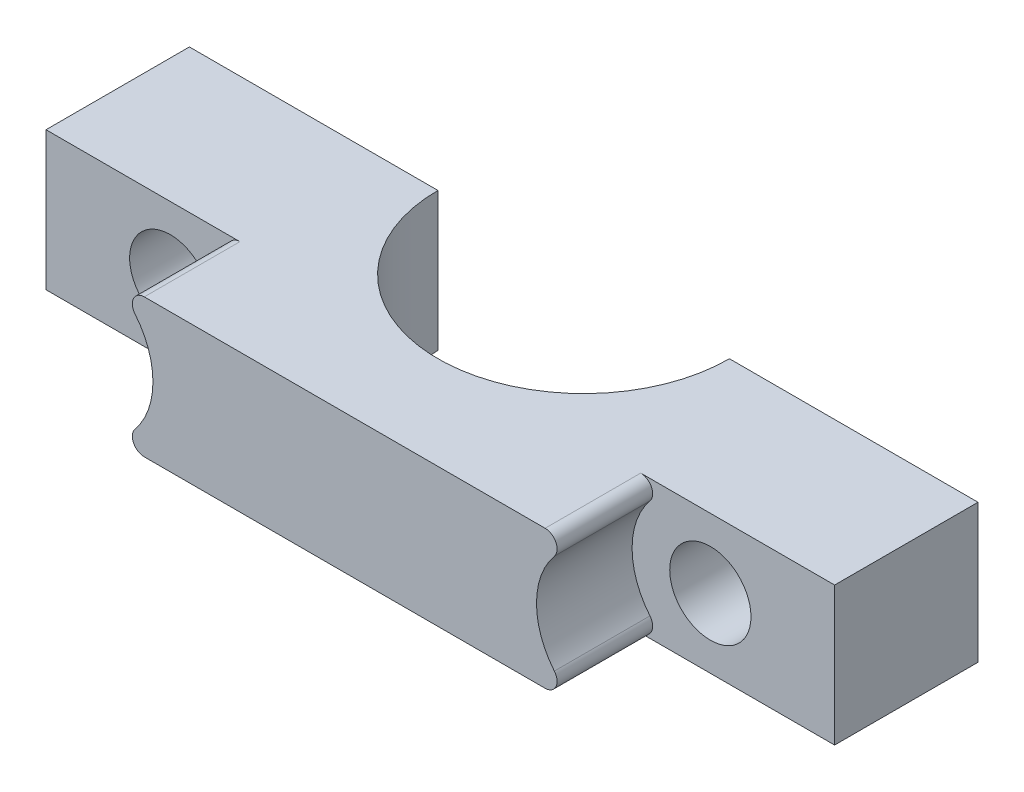
ISO-10303-21;
HEADER;
FILE_DESCRIPTION(('STEP AP214'),'2;1');
FILE_NAME('part.step','',(''),(''),'','','');
FILE_SCHEMA(('AUTOMOTIVE_DESIGN { 1 0 10303 214 1 1 1 1 }'));
ENDSEC;
DATA;
#1=APPLICATION_CONTEXT('core data for automotive mechanical design processes');
#2=APPLICATION_PROTOCOL_DEFINITION('international standard','automotive_design',2000,#1);
#3=PRODUCT_CONTEXT('',#1,'mechanical');
#4=PRODUCT('Part','Part','',(#3));
#5=PRODUCT_RELATED_PRODUCT_CATEGORY('part','',(#4));
#6=PRODUCT_DEFINITION_FORMATION('','',#4);
#7=PRODUCT_DEFINITION_CONTEXT('part definition',#1,'design');
#8=PRODUCT_DEFINITION('design','',#6,#7);
#9=PRODUCT_DEFINITION_SHAPE('','',#8);
#10=(LENGTH_UNIT() NAMED_UNIT(*) SI_UNIT(.MILLI.,.METRE.));
#11=(NAMED_UNIT(*) PLANE_ANGLE_UNIT() SI_UNIT($,.RADIAN.));
#12=(NAMED_UNIT(*) SI_UNIT($,.STERADIAN.) SOLID_ANGLE_UNIT());
#13=UNCERTAINTY_MEASURE_WITH_UNIT(LENGTH_MEASURE(1.E-05),#10,'distance_accuracy_value','');
#14=(GEOMETRIC_REPRESENTATION_CONTEXT(3) GLOBAL_UNCERTAINTY_ASSIGNED_CONTEXT((#13)) GLOBAL_UNIT_ASSIGNED_CONTEXT((#10,
#11,#12)) REPRESENTATION_CONTEXT('',''));
#15=CARTESIAN_POINT('',(0.,0.,0.));
#16=DIRECTION('',(0.,0.,1.));
#17=DIRECTION('',(1.,0.,0.));
#18=AXIS2_PLACEMENT_3D('',#15,#16,#17);
#19=CARTESIAN_POINT('',(-16.5,5.8,-10.));
#20=DIRECTION('',(1.,0.,0.));
#21=DIRECTION('',(0.,0.,-1.));
#22=AXIS2_PLACEMENT_3D('',#19,#20,#21);
#23=PLANE('',#22);
#24=DIRECTION('',(0.,-1.,0.));
#25=VECTOR('',#24,1.);
#26=CARTESIAN_POINT('',(-16.5,5.8,-4.));
#27=LINE('',#26,#25);
#28=CARTESIAN_POINT('',(-16.5,5.8,-4.));
#29=VERTEX_POINT('',#28);
#30=CARTESIAN_POINT('',(-16.5,0.,-4.));
#31=VERTEX_POINT('',#30);
#32=EDGE_CURVE('E272',#29,#31,#27,.T.);
#33=ORIENTED_EDGE('',*,*,#32,.F.);
#34=DIRECTION('',(0.,0.,1.));
#35=VECTOR('',#34,1.);
#36=CARTESIAN_POINT('',(-16.5,5.8,-10.));
#37=LINE('',#36,#35);
#38=CARTESIAN_POINT('',(-16.5,5.8,-10.));
#39=VERTEX_POINT('',#38);
#40=EDGE_CURVE('E175',#39,#29,#37,.T.);
#41=ORIENTED_EDGE('',*,*,#40,.F.);
#42=DIRECTION('',(0.,-1.,0.));
#43=VECTOR('',#42,1.);
#44=CARTESIAN_POINT('',(-16.5,5.8,-10.));
#45=LINE('',#44,#43);
#46=CARTESIAN_POINT('',(-16.5,0.,-10.));
#47=VERTEX_POINT('',#46);
#48=EDGE_CURVE('E176',#39,#47,#45,.T.);
#49=ORIENTED_EDGE('',*,*,#48,.T.);
#50=DIRECTION('',(0.,0.,1.));
#51=VECTOR('',#50,1.);
#52=CARTESIAN_POINT('',(-16.5,0.,-10.));
#53=LINE('',#52,#51);
#54=EDGE_CURVE('E168',#47,#31,#53,.T.);
#55=ORIENTED_EDGE('',*,*,#54,.T.);
#56=EDGE_LOOP('',(#33,#41,#49,#55));
#57=FACE_BOUND('',#56,.T.);
#58=ADVANCED_FACE('F35',(#57),#23,.F.);
#59=CARTESIAN_POINT('',(-11.3,2.9,0.));
#60=DIRECTION('',(0.,0.,1.));
#61=DIRECTION('',(1.,0.,0.));
#62=AXIS2_PLACEMENT_3D('',#59,#60,#61);
#63=CYLINDRICAL_SURFACE('',#62,1.69999999999999);
#64=CARTESIAN_POINT('',(-11.3,2.9,-10.));
#65=DIRECTION('',(0.,0.,1.));
#66=DIRECTION('',(1.,0.,0.));
#67=AXIS2_PLACEMENT_3D('',#64,#65,#66);
#68=CIRCLE('',#67,1.7);
#69=CARTESIAN_POINT('',(-9.6,2.9,-10.));
#70=VERTEX_POINT('',#69);
#71=EDGE_CURVE('E192',#70,#70,#68,.T.);
#72=ORIENTED_EDGE('',*,*,#71,.F.);
#73=EDGE_LOOP('',(#72));
#74=FACE_BOUND('',#73,.T.);
#75=CARTESIAN_POINT('',(-11.3,2.9,-4.));
#76=DIRECTION('',(0.,0.,1.));
#77=DIRECTION('',(1.,0.,0.));
#78=AXIS2_PLACEMENT_3D('',#75,#76,#77);
#79=CIRCLE('',#78,1.69999999999999);
#80=CARTESIAN_POINT('',(-9.6,2.9,-4.));
#81=VERTEX_POINT('',#80);
#82=EDGE_CURVE('E189',#81,#81,#79,.F.);
#83=ORIENTED_EDGE('',*,*,#82,.F.);
#84=EDGE_LOOP('',(#83));
#85=FACE_BOUND('',#84,.T.);
#86=ADVANCED_FACE('F296',(#74,#85),#63,.F.);
#87=CARTESIAN_POINT('',(-16.5,5.8,0.));
#88=DIRECTION('',(0.,0.,-1.));
#89=DIRECTION('',(-1.,0.,0.));
#90=AXIS2_PLACEMENT_3D('',#87,#88,#89);
#91=PLANE('',#90);
#92=DIRECTION('',(1.,0.,0.));
#93=VECTOR('',#92,1.);
#94=CARTESIAN_POINT('',(-16.5,0.,0.));
#95=LINE('',#94,#93);
#96=CARTESIAN_POINT('',(-8.3861322953847,0.,0.));
#97=VERTEX_POINT('',#96);
#98=CARTESIAN_POINT('',(8.3861322953847,0.,0.));
#99=VERTEX_POINT('',#98);
#100=EDGE_CURVE('E163',#97,#99,#95,.T.);
#101=ORIENTED_EDGE('',*,*,#100,.T.);
#102=CARTESIAN_POINT('',(8.3861322953847,0.5,0.));
#103=DIRECTION('',(0.,0.,-1.));
#104=DIRECTION('',(-1.,0.,0.));
#105=AXIS2_PLACEMENT_3D('',#102,#103,#104);
#106=CIRCLE('',#105,0.5);
#107=CARTESIAN_POINT('',(8.77207503771785,0.817880794701987,0.));
#108=VERTEX_POINT('',#107);
#109=EDGE_CURVE('E208',#99,#108,#106,.F.);
#110=ORIENTED_EDGE('',*,*,#109,.T.);
#111=CARTESIAN_POINT('',(11.3,2.9,0.));
#112=DIRECTION('',(0.,0.,1.));
#113=DIRECTION('',(-1.,0.,0.));
#114=AXIS2_PLACEMENT_3D('',#111,#112,#113);
#115=CIRCLE('',#114,3.275);
#116=CARTESIAN_POINT('',(8.77207503771785,4.98211920529801,0.));
#117=VERTEX_POINT('',#116);
#118=EDGE_CURVE('E237',#117,#108,#115,.T.);
#119=ORIENTED_EDGE('',*,*,#118,.F.);
#120=CARTESIAN_POINT('',(8.3861322953847,5.3,0.));
#121=DIRECTION('',(0.,0.,-1.));
#122=DIRECTION('',(-1.,0.,0.));
#123=AXIS2_PLACEMENT_3D('',#120,#121,#122);
#124=CIRCLE('',#123,0.5);
#125=CARTESIAN_POINT('',(8.3861322953847,5.8,0.));
#126=VERTEX_POINT('',#125);
#127=EDGE_CURVE('E206',#117,#126,#124,.F.);
#128=ORIENTED_EDGE('',*,*,#127,.T.);
#129=DIRECTION('',(1.,0.,0.));
#130=VECTOR('',#129,1.);
#131=CARTESIAN_POINT('',(-16.5,5.8,0.));
#132=LINE('',#131,#130);
#133=CARTESIAN_POINT('',(-8.3861322953847,5.8,0.));
#134=VERTEX_POINT('',#133);
#135=EDGE_CURVE('E244',#134,#126,#132,.T.);
#136=ORIENTED_EDGE('',*,*,#135,.F.);
#137=CARTESIAN_POINT('',(-8.3861322953847,5.3,0.));
#138=DIRECTION('',(0.,0.,-1.));
#139=DIRECTION('',(-1.,0.,0.));
#140=AXIS2_PLACEMENT_3D('',#137,#138,#139);
#141=CIRCLE('',#140,0.5);
#142=CARTESIAN_POINT('',(-8.77207503771785,4.98211920529801,0.));
#143=VERTEX_POINT('',#142);
#144=EDGE_CURVE('E202',#134,#143,#141,.F.);
#145=ORIENTED_EDGE('',*,*,#144,.T.);
#146=CARTESIAN_POINT('',(-11.3,2.9,0.));
#147=DIRECTION('',(0.,0.,1.));
#148=DIRECTION('',(1.,0.,0.));
#149=AXIS2_PLACEMENT_3D('',#146,#147,#148);
#150=CIRCLE('',#149,3.275);
#151=CARTESIAN_POINT('',(-8.77207503771785,0.817880794701986,0.));
#152=VERTEX_POINT('',#151);
#153=EDGE_CURVE('E197',#152,#143,#150,.T.);
#154=ORIENTED_EDGE('',*,*,#153,.F.);
#155=CARTESIAN_POINT('',(-8.3861322953847,0.5,0.));
#156=DIRECTION('',(0.,0.,-1.));
#157=DIRECTION('',(-1.,0.,0.));
#158=AXIS2_PLACEMENT_3D('',#155,#156,#157);
#159=CIRCLE('',#158,0.5);
#160=EDGE_CURVE('E204',#152,#97,#159,.F.);
#161=ORIENTED_EDGE('',*,*,#160,.T.);
#162=EDGE_LOOP('',(#101,#110,#119,#128,#136,#145,#154,#161));
#163=FACE_BOUND('',#162,.T.);
#164=ADVANCED_FACE('F243',(#163),#91,.F.);
#165=CARTESIAN_POINT('',(16.5,5.8,0.));
#166=DIRECTION('',(-1.,0.,0.));
#167=DIRECTION('',(0.,0.,1.));
#168=AXIS2_PLACEMENT_3D('',#165,#166,#167);
#169=PLANE('',#168);
#170=DIRECTION('',(0.,0.,-1.));
#171=VECTOR('',#170,1.);
#172=CARTESIAN_POINT('',(16.5,5.8,0.));
#173=LINE('',#172,#171);
#174=CARTESIAN_POINT('',(16.5,5.8,-4.));
#175=VERTEX_POINT('',#174);
#176=CARTESIAN_POINT('',(16.5,5.8,-10.));
#177=VERTEX_POINT('',#176);
#178=EDGE_CURVE('E156',#175,#177,#173,.T.);
#179=ORIENTED_EDGE('',*,*,#178,.F.);
#180=DIRECTION('',(0.,1.,0.));
#181=VECTOR('',#180,1.);
#182=CARTESIAN_POINT('',(16.5,5.8,-4.));
#183=LINE('',#182,#181);
#184=CARTESIAN_POINT('',(16.5,0.,-4.));
#185=VERTEX_POINT('',#184);
#186=EDGE_CURVE('E139',#185,#175,#183,.T.);
#187=ORIENTED_EDGE('',*,*,#186,.F.);
#188=DIRECTION('',(0.,0.,-1.));
#189=VECTOR('',#188,1.);
#190=CARTESIAN_POINT('',(16.5,0.,0.));
#191=LINE('',#190,#189);
#192=CARTESIAN_POINT('',(16.5,0.,-10.));
#193=VERTEX_POINT('',#192);
#194=EDGE_CURVE('E154',#185,#193,#191,.T.);
#195=ORIENTED_EDGE('',*,*,#194,.T.);
#196=DIRECTION('',(0.,-1.,0.));
#197=VECTOR('',#196,1.);
#198=CARTESIAN_POINT('',(16.5,5.8,-10.));
#199=LINE('',#198,#197);
#200=EDGE_CURVE('E186',#177,#193,#199,.T.);
#201=ORIENTED_EDGE('',*,*,#200,.F.);
#202=EDGE_LOOP('',(#179,#187,#195,#201));
#203=FACE_BOUND('',#202,.T.);
#204=ADVANCED_FACE('F152',(#203),#169,.F.);
#205=CARTESIAN_POINT('',(16.5,5.8,-10.));
#206=DIRECTION('',(0.,0.,1.));
#207=DIRECTION('',(1.,0.,0.));
#208=AXIS2_PLACEMENT_3D('',#205,#206,#207);
#209=PLANE('',#208);
#210=CARTESIAN_POINT('',(11.3,2.9,-10.));
#211=DIRECTION('',(0.,0.,1.));
#212=DIRECTION('',(1.,0.,0.));
#213=AXIS2_PLACEMENT_3D('',#210,#211,#212);
#214=CIRCLE('',#213,1.7);
#215=CARTESIAN_POINT('',(13.,2.9,-10.));
#216=VERTEX_POINT('',#215);
#217=EDGE_CURVE('E259',#216,#216,#214,.T.);
#218=ORIENTED_EDGE('',*,*,#217,.T.);
#219=EDGE_LOOP('',(#218));
#220=FACE_BOUND('',#219,.T.);
#221=DIRECTION('',(-1.,0.,0.));
#222=VECTOR('',#221,1.);
#223=CARTESIAN_POINT('',(16.5,0.,-10.));
#224=LINE('',#223,#222);
#225=CARTESIAN_POINT('',(6.1,0.,-10.));
#226=VERTEX_POINT('',#225);
#227=EDGE_CURVE('E162',#193,#226,#224,.T.);
#228=ORIENTED_EDGE('',*,*,#227,.T.);
#229=DIRECTION('',(0.,-1.,0.));
#230=VECTOR('',#229,1.);
#231=CARTESIAN_POINT('',(6.1,5.8,-10.));
#232=LINE('',#231,#230);
#233=CARTESIAN_POINT('',(6.1,5.8,-10.));
#234=VERTEX_POINT('',#233);
#235=EDGE_CURVE('E183',#234,#226,#232,.T.);
#236=ORIENTED_EDGE('',*,*,#235,.F.);
#237=DIRECTION('',(-1.,0.,0.));
#238=VECTOR('',#237,1.);
#239=CARTESIAN_POINT('',(16.5,5.8,-10.));
#240=LINE('',#239,#238);
#241=EDGE_CURVE('E249',#177,#234,#240,.T.);
#242=ORIENTED_EDGE('',*,*,#241,.F.);
#243=ORIENTED_EDGE('',*,*,#200,.T.);
#244=EDGE_LOOP('',(#228,#236,#242,#243));
#245=FACE_BOUND('',#244,.T.);
#246=ADVANCED_FACE('F410',(#220,#245),#209,.F.);
#247=CARTESIAN_POINT('',(0.,5.8,-9.99999999999999));
#248=DIRECTION('',(0.,-1.,0.));
#249=DIRECTION('',(0.,0.,-1.));
#250=AXIS2_PLACEMENT_3D('',#247,#248,#249);
#251=CYLINDRICAL_SURFACE('',#250,6.1);
#252=CARTESIAN_POINT('',(0.,0.,-9.99999999999999));
#253=DIRECTION('',(0.,-1.,0.));
#254=DIRECTION('',(0.,0.,-1.));
#255=AXIS2_PLACEMENT_3D('',#252,#253,#254);
#256=CIRCLE('',#255,6.1);
#257=CARTESIAN_POINT('',(-6.1,0.,-10.));
#258=VERTEX_POINT('',#257);
#259=EDGE_CURVE('E165',#226,#258,#256,.T.);
#260=ORIENTED_EDGE('',*,*,#259,.T.);
#261=DIRECTION('',(0.,-1.,0.));
#262=VECTOR('',#261,1.);
#263=CARTESIAN_POINT('',(-6.1,5.8,-10.));
#264=LINE('',#263,#262);
#265=CARTESIAN_POINT('',(-6.1,5.8,-10.));
#266=VERTEX_POINT('',#265);
#267=EDGE_CURVE('E179',#266,#258,#264,.T.);
#268=ORIENTED_EDGE('',*,*,#267,.F.);
#269=CARTESIAN_POINT('',(0.,5.8,-9.99999999999999));
#270=DIRECTION('',(0.,-1.,0.));
#271=DIRECTION('',(0.,0.,-1.));
#272=AXIS2_PLACEMENT_3D('',#269,#270,#271);
#273=CIRCLE('',#272,6.1);
#274=EDGE_CURVE('E256',#234,#266,#273,.T.);
#275=ORIENTED_EDGE('',*,*,#274,.F.);
#276=ORIENTED_EDGE('',*,*,#235,.T.);
#277=EDGE_LOOP('',(#260,#268,#275,#276));
#278=FACE_BOUND('',#277,.T.);
#279=ADVANCED_FACE('F400',(#278),#251,.F.);
#280=CARTESIAN_POINT('',(-6.1,5.8,-10.));
#281=DIRECTION('',(0.,0.,1.));
#282=DIRECTION('',(1.,0.,0.));
#283=AXIS2_PLACEMENT_3D('',#280,#281,#282);
#284=PLANE('',#283);
#285=ORIENTED_EDGE('',*,*,#71,.T.);
#286=EDGE_LOOP('',(#285));
#287=FACE_BOUND('',#286,.T.);
#288=DIRECTION('',(-1.,0.,0.));
#289=VECTOR('',#288,1.);
#290=CARTESIAN_POINT('',(-6.1,0.,-10.));
#291=LINE('',#290,#289);
#292=EDGE_CURVE('E173',#258,#47,#291,.T.);
#293=ORIENTED_EDGE('',*,*,#292,.T.);
#294=ORIENTED_EDGE('',*,*,#48,.F.);
#295=DIRECTION('',(-1.,0.,0.));
#296=VECTOR('',#295,1.);
#297=CARTESIAN_POINT('',(-6.1,5.8,-10.));
#298=LINE('',#297,#296);
#299=EDGE_CURVE('E180',#266,#39,#298,.T.);
#300=ORIENTED_EDGE('',*,*,#299,.F.);
#301=ORIENTED_EDGE('',*,*,#267,.T.);
#302=EDGE_LOOP('',(#293,#294,#300,#301));
#303=FACE_BOUND('',#302,.T.);
#304=ADVANCED_FACE('F393',(#287,#303),#284,.F.);
#305=CARTESIAN_POINT('',(0.,5.8,-9.99999999999999));
#306=DIRECTION('',(0.,-1.,0.));
#307=DIRECTION('',(0.,0.,-1.));
#308=AXIS2_PLACEMENT_3D('',#305,#306,#307);
#309=PLANE('',#308);
#310=ORIENTED_EDGE('',*,*,#135,.T.);
#311=DIRECTION('',(0.,0.,1.));
#312=VECTOR('',#311,1.);
#313=CARTESIAN_POINT('',(8.3861322953847,5.8,-9.99999999999999));
#314=LINE('',#313,#312);
#315=CARTESIAN_POINT('',(8.3861322953847,5.8,-4.));
#316=VERTEX_POINT('',#315);
#317=EDGE_CURVE('E218',#126,#316,#314,.F.);
#318=ORIENTED_EDGE('',*,*,#317,.T.);
#319=DIRECTION('',(-1.,0.,0.));
#320=VECTOR('',#319,1.);
#321=CARTESIAN_POINT('',(9.77828222064668,5.8,-4.));
#322=LINE('',#321,#320);
#323=EDGE_CURVE('E157',#175,#316,#322,.T.);
#324=ORIENTED_EDGE('',*,*,#323,.F.);
#325=ORIENTED_EDGE('',*,*,#178,.T.);
#326=ORIENTED_EDGE('',*,*,#241,.T.);
#327=ORIENTED_EDGE('',*,*,#274,.T.);
#328=ORIENTED_EDGE('',*,*,#299,.T.);
#329=ORIENTED_EDGE('',*,*,#40,.T.);
#330=DIRECTION('',(-1.,0.,0.));
#331=VECTOR('',#330,1.);
#332=CARTESIAN_POINT('',(-9.77828222064668,5.8,-4.));
#333=LINE('',#332,#331);
#334=CARTESIAN_POINT('',(-8.3861322953847,5.8,-4.));
#335=VERTEX_POINT('',#334);
#336=EDGE_CURVE('E274',#335,#29,#333,.T.);
#337=ORIENTED_EDGE('',*,*,#336,.F.);
#338=DIRECTION('',(0.,0.,1.));
#339=VECTOR('',#338,1.);
#340=CARTESIAN_POINT('',(-8.3861322953847,5.8,-9.99999999999999));
#341=LINE('',#340,#339);
#342=EDGE_CURVE('E215',#335,#134,#341,.T.);
#343=ORIENTED_EDGE('',*,*,#342,.T.);
#344=EDGE_LOOP('',(#310,#318,#324,#325,#326,#327,#328,#329,#337,#343));
#345=FACE_BOUND('',#344,.T.);
#346=ADVANCED_FACE('F246',(#345),#309,.F.);
#347=CARTESIAN_POINT('',(0.,0.,-9.99999999999999));
#348=DIRECTION('',(0.,-1.,0.));
#349=DIRECTION('',(0.,0.,-1.));
#350=AXIS2_PLACEMENT_3D('',#347,#348,#349);
#351=PLANE('',#350);
#352=DIRECTION('',(1.,0.,0.));
#353=VECTOR('',#352,1.);
#354=CARTESIAN_POINT('',(16.5,0.,-4.));
#355=LINE('',#354,#353);
#356=CARTESIAN_POINT('',(8.3861322953847,0.,-4.));
#357=VERTEX_POINT('',#356);
#358=EDGE_CURVE('E135',#357,#185,#355,.T.);
#359=ORIENTED_EDGE('',*,*,#358,.F.);
#360=DIRECTION('',(0.,0.,-1.));
#361=VECTOR('',#360,1.);
#362=CARTESIAN_POINT('',(8.3861322953847,0.,0.));
#363=LINE('',#362,#361);
#364=EDGE_CURVE('E200',#357,#99,#363,.F.);
#365=ORIENTED_EDGE('',*,*,#364,.T.);
#366=ORIENTED_EDGE('',*,*,#100,.F.);
#367=DIRECTION('',(0.,0.,-1.));
#368=VECTOR('',#367,1.);
#369=CARTESIAN_POINT('',(-8.3861322953847,0.,-4.));
#370=LINE('',#369,#368);
#371=CARTESIAN_POINT('',(-8.3861322953847,0.,-4.));
#372=VERTEX_POINT('',#371);
#373=EDGE_CURVE('E188',#97,#372,#370,.T.);
#374=ORIENTED_EDGE('',*,*,#373,.T.);
#375=DIRECTION('',(1.,0.,0.));
#376=VECTOR('',#375,1.);
#377=CARTESIAN_POINT('',(-16.5,0.,-4.));
#378=LINE('',#377,#376);
#379=EDGE_CURVE('E193',#31,#372,#378,.T.);
#380=ORIENTED_EDGE('',*,*,#379,.F.);
#381=ORIENTED_EDGE('',*,*,#54,.F.);
#382=ORIENTED_EDGE('',*,*,#292,.F.);
#383=ORIENTED_EDGE('',*,*,#259,.F.);
#384=ORIENTED_EDGE('',*,*,#227,.F.);
#385=ORIENTED_EDGE('',*,*,#194,.F.);
#386=EDGE_LOOP('',(#359,#365,#366,#374,#380,#381,#382,#383,#384,#385));
#387=FACE_BOUND('',#386,.T.);
#388=ADVANCED_FACE('F160',(#387),#351,.T.);
#389=CARTESIAN_POINT('',(11.3,2.9,0.));
#390=DIRECTION('',(0.,0.,1.));
#391=DIRECTION('',(1.,0.,0.));
#392=AXIS2_PLACEMENT_3D('',#389,#390,#391);
#393=CYLINDRICAL_SURFACE('',#392,1.69999999999999);
#394=CARTESIAN_POINT('',(11.3,2.9,-4.));
#395=DIRECTION('',(0.,0.,-1.));
#396=DIRECTION('',(-1.,0.,0.));
#397=AXIS2_PLACEMENT_3D('',#394,#395,#396);
#398=CIRCLE('',#397,1.69999999999999);
#399=CARTESIAN_POINT('',(9.6,2.9,-4.));
#400=VERTEX_POINT('',#399);
#401=EDGE_CURVE('E194',#400,#400,#398,.F.);
#402=ORIENTED_EDGE('',*,*,#401,.T.);
#403=EDGE_LOOP('',(#402));
#404=FACE_BOUND('',#403,.T.);
#405=ORIENTED_EDGE('',*,*,#217,.F.);
#406=EDGE_LOOP('',(#405));
#407=FACE_BOUND('',#406,.T.);
#408=ADVANCED_FACE('F358',(#404,#407),#393,.F.);
#409=CARTESIAN_POINT('',(-11.3,2.9,-4.));
#410=DIRECTION('',(0.,0.,1.));
#411=DIRECTION('',(1.,0.,0.));
#412=AXIS2_PLACEMENT_3D('',#409,#410,#411);
#413=PLANE('',#412);
#414=ORIENTED_EDGE('',*,*,#379,.T.);
#415=CARTESIAN_POINT('',(-8.3861322953847,0.5,-4.));
#416=DIRECTION('',(0.,0.,1.));
#417=DIRECTION('',(1.,0.,0.));
#418=AXIS2_PLACEMENT_3D('',#415,#416,#417);
#419=CIRCLE('',#418,0.5);
#420=CARTESIAN_POINT('',(-8.77207503771785,0.817880794701986,-4.));
#421=VERTEX_POINT('',#420);
#422=EDGE_CURVE('E43',#372,#421,#419,.F.);
#423=ORIENTED_EDGE('',*,*,#422,.T.);
#424=CARTESIAN_POINT('',(-11.3,2.9,-4.));
#425=DIRECTION('',(0.,0.,1.));
#426=DIRECTION('',(1.,0.,0.));
#427=AXIS2_PLACEMENT_3D('',#424,#425,#426);
#428=CIRCLE('',#427,3.275);
#429=CARTESIAN_POINT('',(-8.77207503771785,4.98211920529801,-4.));
#430=VERTEX_POINT('',#429);
#431=EDGE_CURVE('E270',#421,#430,#428,.T.);
#432=ORIENTED_EDGE('',*,*,#431,.T.);
#433=CARTESIAN_POINT('',(-8.3861322953847,5.3,-4.));
#434=DIRECTION('',(0.,0.,1.));
#435=DIRECTION('',(1.,0.,0.));
#436=AXIS2_PLACEMENT_3D('',#433,#434,#435);
#437=CIRCLE('',#436,0.5);
#438=EDGE_CURVE('E11',#430,#335,#437,.F.);
#439=ORIENTED_EDGE('',*,*,#438,.T.);
#440=ORIENTED_EDGE('',*,*,#336,.T.);
#441=ORIENTED_EDGE('',*,*,#32,.T.);
#442=EDGE_LOOP('',(#414,#423,#432,#439,#440,#441));
#443=FACE_BOUND('',#442,.T.);
#444=ORIENTED_EDGE('',*,*,#82,.T.);
#445=EDGE_LOOP('',(#444));
#446=FACE_BOUND('',#445,.T.);
#447=ADVANCED_FACE('F288',(#443,#446),#413,.T.);
#448=CARTESIAN_POINT('',(-11.3,2.9,-4.));
#449=DIRECTION('',(0.,0.,1.));
#450=DIRECTION('',(1.,0.,0.));
#451=AXIS2_PLACEMENT_3D('',#448,#449,#450);
#452=CYLINDRICAL_SURFACE('',#451,3.275);
#453=ORIENTED_EDGE('',*,*,#431,.F.);
#454=DIRECTION('',(0.,0.,1.));
#455=VECTOR('',#454,1.);
#456=CARTESIAN_POINT('',(-8.77207503771785,0.817880794701986,-4.));
#457=LINE('',#456,#455);
#458=EDGE_CURVE('E222',#421,#152,#457,.T.);
#459=ORIENTED_EDGE('',*,*,#458,.T.);
#460=ORIENTED_EDGE('',*,*,#153,.T.);
#461=DIRECTION('',(0.,0.,1.));
#462=VECTOR('',#461,1.);
#463=CARTESIAN_POINT('',(-8.77207503771785,4.98211920529801,-4.));
#464=LINE('',#463,#462);
#465=EDGE_CURVE('E50',#143,#430,#464,.F.);
#466=ORIENTED_EDGE('',*,*,#465,.T.);
#467=EDGE_LOOP('',(#453,#459,#460,#466));
#468=FACE_BOUND('',#467,.T.);
#469=ADVANCED_FACE('F286',(#468),#452,.F.);
#470=CARTESIAN_POINT('',(11.3,2.9,-4.));
#471=DIRECTION('',(0.,0.,-1.));
#472=DIRECTION('',(-1.,0.,0.));
#473=AXIS2_PLACEMENT_3D('',#470,#471,#472);
#474=PLANE('',#473);
#475=ORIENTED_EDGE('',*,*,#323,.T.);
#476=CARTESIAN_POINT('',(8.3861322953847,5.3,-4.));
#477=DIRECTION('',(0.,0.,-1.));
#478=DIRECTION('',(-1.,0.,0.));
#479=AXIS2_PLACEMENT_3D('',#476,#477,#478);
#480=CIRCLE('',#479,0.5);
#481=CARTESIAN_POINT('',(8.77207503771785,4.98211920529801,-4.));
#482=VERTEX_POINT('',#481);
#483=EDGE_CURVE('E226',#316,#482,#480,.T.);
#484=ORIENTED_EDGE('',*,*,#483,.T.);
#485=CARTESIAN_POINT('',(11.3,2.9,-4.));
#486=DIRECTION('',(0.,0.,1.));
#487=DIRECTION('',(-1.,0.,0.));
#488=AXIS2_PLACEMENT_3D('',#485,#486,#487);
#489=CIRCLE('',#488,3.275);
#490=CARTESIAN_POINT('',(8.77207503771785,0.817880794701987,-4.));
#491=VERTEX_POINT('',#490);
#492=EDGE_CURVE('E148',#482,#491,#489,.T.);
#493=ORIENTED_EDGE('',*,*,#492,.T.);
#494=CARTESIAN_POINT('',(8.3861322953847,0.5,-4.));
#495=DIRECTION('',(0.,0.,-1.));
#496=DIRECTION('',(-1.,0.,0.));
#497=AXIS2_PLACEMENT_3D('',#494,#495,#496);
#498=CIRCLE('',#497,0.5);
#499=EDGE_CURVE('E143',#491,#357,#498,.T.);
#500=ORIENTED_EDGE('',*,*,#499,.T.);
#501=ORIENTED_EDGE('',*,*,#358,.T.);
#502=ORIENTED_EDGE('',*,*,#186,.T.);
#503=EDGE_LOOP('',(#475,#484,#493,#500,#501,#502));
#504=FACE_BOUND('',#503,.T.);
#505=ORIENTED_EDGE('',*,*,#401,.F.);
#506=EDGE_LOOP('',(#505));
#507=FACE_BOUND('',#506,.T.);
#508=ADVANCED_FACE('F137',(#504,#507),#474,.F.);
#509=CARTESIAN_POINT('',(11.3,2.9,-4.));
#510=DIRECTION('',(0.,0.,1.));
#511=DIRECTION('',(1.,0.,0.));
#512=AXIS2_PLACEMENT_3D('',#509,#510,#511);
#513=CYLINDRICAL_SURFACE('',#512,3.275);
#514=ORIENTED_EDGE('',*,*,#118,.T.);
#515=DIRECTION('',(0.,0.,1.));
#516=VECTOR('',#515,1.);
#517=CARTESIAN_POINT('',(8.77207503771785,0.817880794701987,-4.));
#518=LINE('',#517,#516);
#519=EDGE_CURVE('E213',#108,#491,#518,.F.);
#520=ORIENTED_EDGE('',*,*,#519,.T.);
#521=ORIENTED_EDGE('',*,*,#492,.F.);
#522=DIRECTION('',(0.,0.,1.));
#523=VECTOR('',#522,1.);
#524=CARTESIAN_POINT('',(8.77207503771785,4.98211920529801,-4.));
#525=LINE('',#524,#523);
#526=EDGE_CURVE('E210',#482,#117,#525,.T.);
#527=ORIENTED_EDGE('',*,*,#526,.T.);
#528=EDGE_LOOP('',(#514,#520,#521,#527));
#529=FACE_BOUND('',#528,.T.);
#530=ADVANCED_FACE('F234',(#529),#513,.F.);
#531=CARTESIAN_POINT('',(8.3861322953847,0.5,-4.));
#532=DIRECTION('',(0.,0.,1.));
#533=DIRECTION('',(1.,0.,0.));
#534=AXIS2_PLACEMENT_3D('',#531,#532,#533);
#535=CYLINDRICAL_SURFACE('',#534,0.5);
#536=ORIENTED_EDGE('',*,*,#499,.F.);
#537=ORIENTED_EDGE('',*,*,#519,.F.);
#538=ORIENTED_EDGE('',*,*,#109,.F.);
#539=ORIENTED_EDGE('',*,*,#364,.F.);
#540=EDGE_LOOP('',(#536,#537,#538,#539));
#541=FACE_BOUND('',#540,.T.);
#542=ADVANCED_FACE('F279',(#541),#535,.T.);
#543=CARTESIAN_POINT('',(8.3861322953847,5.3,-4.));
#544=DIRECTION('',(0.,0.,1.));
#545=DIRECTION('',(1.,0.,0.));
#546=AXIS2_PLACEMENT_3D('',#543,#544,#545);
#547=CYLINDRICAL_SURFACE('',#546,0.5);
#548=ORIENTED_EDGE('',*,*,#483,.F.);
#549=ORIENTED_EDGE('',*,*,#317,.F.);
#550=ORIENTED_EDGE('',*,*,#127,.F.);
#551=ORIENTED_EDGE('',*,*,#526,.F.);
#552=EDGE_LOOP('',(#548,#549,#550,#551));
#553=FACE_BOUND('',#552,.T.);
#554=ADVANCED_FACE('F239',(#553),#547,.T.);
#555=CARTESIAN_POINT('',(-8.3861322953847,0.5,-4.));
#556=DIRECTION('',(0.,0.,1.));
#557=DIRECTION('',(1.,0.,0.));
#558=AXIS2_PLACEMENT_3D('',#555,#556,#557);
#559=CYLINDRICAL_SURFACE('',#558,0.5);
#560=ORIENTED_EDGE('',*,*,#422,.F.);
#561=ORIENTED_EDGE('',*,*,#373,.F.);
#562=ORIENTED_EDGE('',*,*,#160,.F.);
#563=ORIENTED_EDGE('',*,*,#458,.F.);
#564=EDGE_LOOP('',(#560,#561,#562,#563));
#565=FACE_BOUND('',#564,.T.);
#566=ADVANCED_FACE('F285',(#565),#559,.T.);
#567=CARTESIAN_POINT('',(-8.3861322953847,5.3,-4.));
#568=DIRECTION('',(0.,0.,1.));
#569=DIRECTION('',(1.,0.,0.));
#570=AXIS2_PLACEMENT_3D('',#567,#568,#569);
#571=CYLINDRICAL_SURFACE('',#570,0.5);
#572=ORIENTED_EDGE('',*,*,#438,.F.);
#573=ORIENTED_EDGE('',*,*,#465,.F.);
#574=ORIENTED_EDGE('',*,*,#144,.F.);
#575=ORIENTED_EDGE('',*,*,#342,.F.);
#576=EDGE_LOOP('',(#572,#573,#574,#575));
#577=FACE_BOUND('',#576,.T.);
#578=ADVANCED_FACE('F37',(#577),#571,.T.);
#579=CLOSED_SHELL('',(#58,#86,#164,#204,#246,#279,#304,#346,#388,#408,#447,#469,#508,#530,#542,
#554,#566,#578));
#580=MANIFOLD_SOLID_BREP('B2',#579);
#581=ADVANCED_BREP_SHAPE_REPRESENTATION('',(#18,#580),#14);
#582=SHAPE_DEFINITION_REPRESENTATION(#9,#581);
ENDSEC;
END-ISO-10303-21;
